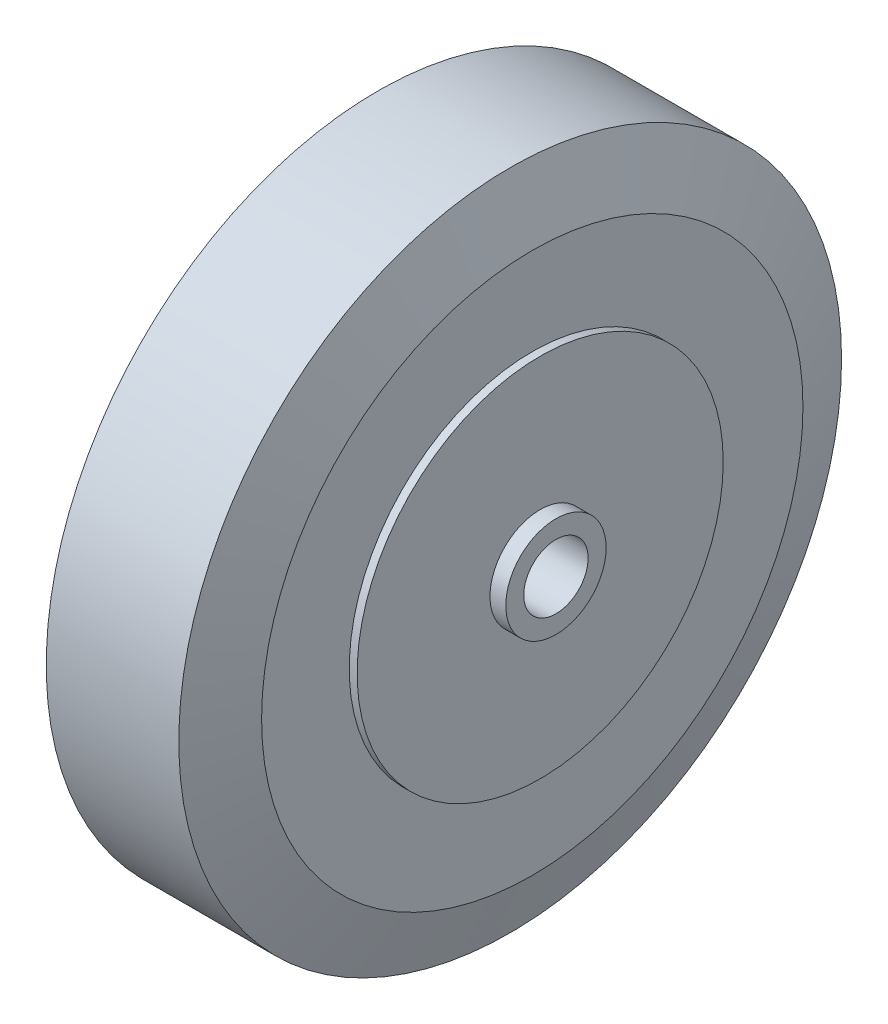
ISO-10303-21;
HEADER;
FILE_DESCRIPTION(('STEP AP214'),'2;1');
FILE_NAME('part.step','',(''),(''),'','','');
FILE_SCHEMA(('AUTOMOTIVE_DESIGN { 1 0 10303 214 1 1 1 1 }'));
ENDSEC;
DATA;
#1=APPLICATION_CONTEXT('core data for automotive mechanical design processes');
#2=APPLICATION_PROTOCOL_DEFINITION('international standard','automotive_design',2000,#1);
#3=PRODUCT_CONTEXT('',#1,'mechanical');
#4=PRODUCT('Part','Part','',(#3));
#5=PRODUCT_RELATED_PRODUCT_CATEGORY('part','',(#4));
#6=PRODUCT_DEFINITION_FORMATION('','',#4);
#7=PRODUCT_DEFINITION_CONTEXT('part definition',#1,'design');
#8=PRODUCT_DEFINITION('design','',#6,#7);
#9=PRODUCT_DEFINITION_SHAPE('','',#8);
#10=(LENGTH_UNIT() NAMED_UNIT(*) SI_UNIT(.MILLI.,.METRE.));
#11=(NAMED_UNIT(*) PLANE_ANGLE_UNIT() SI_UNIT($,.RADIAN.));
#12=(NAMED_UNIT(*) SI_UNIT($,.STERADIAN.) SOLID_ANGLE_UNIT());
#13=UNCERTAINTY_MEASURE_WITH_UNIT(LENGTH_MEASURE(1.E-05),#10,'distance_accuracy_value','');
#14=(GEOMETRIC_REPRESENTATION_CONTEXT(3) GLOBAL_UNCERTAINTY_ASSIGNED_CONTEXT((#13)) GLOBAL_UNIT_ASSIGNED_CONTEXT((#10,
#11,#12)) REPRESENTATION_CONTEXT('',''));
#15=CARTESIAN_POINT('',(0.,0.,0.));
#16=DIRECTION('',(0.,0.,1.));
#17=DIRECTION('',(1.,0.,0.));
#18=AXIS2_PLACEMENT_3D('',#15,#16,#17);
#19=CARTESIAN_POINT('',(0.,0.,0.));
#20=DIRECTION('',(1.,0.,0.));
#21=DIRECTION('',(0.,0.,-1.));
#22=AXIS2_PLACEMENT_3D('',#19,#20,#21);
#23=CYLINDRICAL_SURFACE('',#22,10.2);
#24=CARTESIAN_POINT('',(-35.5,0.,0.));
#25=DIRECTION('',(1.,0.,0.));
#26=DIRECTION('',(0.,0.,-1.));
#27=AXIS2_PLACEMENT_3D('',#24,#25,#26);
#28=CIRCLE('',#27,10.2);
#29=CARTESIAN_POINT('',(-35.5,0.,-10.2));
#30=VERTEX_POINT('',#29);
#31=EDGE_CURVE('E10',#30,#30,#28,.T.);
#32=ORIENTED_EDGE('',*,*,#31,.F.);
#33=EDGE_LOOP('',(#32));
#34=FACE_BOUND('',#33,.T.);
#35=CARTESIAN_POINT('',(35.5,0.,0.));
#36=DIRECTION('',(1.,0.,0.));
#37=DIRECTION('',(0.,0.,-1.));
#38=AXIS2_PLACEMENT_3D('',#35,#36,#37);
#39=CIRCLE('',#38,10.2);
#40=CARTESIAN_POINT('',(35.5,0.,-10.2));
#41=VERTEX_POINT('',#40);
#42=EDGE_CURVE('E61',#41,#41,#39,.T.);
#43=ORIENTED_EDGE('',*,*,#42,.T.);
#44=EDGE_LOOP('',(#43));
#45=FACE_BOUND('',#44,.T.);
#46=ADVANCED_FACE('F33',(#34,#45),#23,.F.);
#47=CARTESIAN_POINT('',(-35.5,10.2,0.));
#48=DIRECTION('',(-1.,0.,0.));
#49=DIRECTION('',(0.,0.,1.));
#50=AXIS2_PLACEMENT_3D('',#47,#48,#49);
#51=PLANE('',#50);
#52=ORIENTED_EDGE('',*,*,#31,.T.);
#53=EDGE_LOOP('',(#52));
#54=FACE_BOUND('',#53,.T.);
#55=CARTESIAN_POINT('',(-35.5,0.,0.));
#56=DIRECTION('',(1.,0.,0.));
#57=DIRECTION('',(0.,0.,-1.));
#58=AXIS2_PLACEMENT_3D('',#55,#56,#57);
#59=CIRCLE('',#58,15.9);
#60=CARTESIAN_POINT('',(-35.5,0.,-15.9));
#61=VERTEX_POINT('',#60);
#62=EDGE_CURVE('E39',#61,#61,#59,.T.);
#63=ORIENTED_EDGE('',*,*,#62,.F.);
#64=EDGE_LOOP('',(#63));
#65=FACE_BOUND('',#64,.T.);
#66=ADVANCED_FACE('F102',(#54,#65),#51,.T.);
#67=CARTESIAN_POINT('',(0.,0.,0.));
#68=DIRECTION('',(1.,0.,0.));
#69=DIRECTION('',(0.,0.,-1.));
#70=AXIS2_PLACEMENT_3D('',#67,#68,#69);
#71=CYLINDRICAL_SURFACE('',#70,15.9);
#72=ORIENTED_EDGE('',*,*,#62,.T.);
#73=EDGE_LOOP('',(#72));
#74=FACE_BOUND('',#73,.T.);
#75=CARTESIAN_POINT('',(-30.5,0.,0.));
#76=DIRECTION('',(1.,0.,0.));
#77=DIRECTION('',(0.,0.,-1.));
#78=AXIS2_PLACEMENT_3D('',#75,#76,#77);
#79=CIRCLE('',#78,15.9);
#80=CARTESIAN_POINT('',(-30.5,0.,-15.9));
#81=VERTEX_POINT('',#80);
#82=EDGE_CURVE('E43',#81,#81,#79,.T.);
#83=ORIENTED_EDGE('',*,*,#82,.F.);
#84=EDGE_LOOP('',(#83));
#85=FACE_BOUND('',#84,.T.);
#86=ADVANCED_FACE('F107',(#74,#85),#71,.T.);
#87=CARTESIAN_POINT('',(-30.5,15.9,0.));
#88=DIRECTION('',(-1.,0.,0.));
#89=DIRECTION('',(0.,0.,1.));
#90=AXIS2_PLACEMENT_3D('',#87,#88,#89);
#91=PLANE('',#90);
#92=ORIENTED_EDGE('',*,*,#82,.T.);
#93=EDGE_LOOP('',(#92));
#94=FACE_BOUND('',#93,.T.);
#95=CARTESIAN_POINT('',(-30.5,0.,0.));
#96=DIRECTION('',(1.,0.,0.));
#97=DIRECTION('',(0.,0.,-1.));
#98=AXIS2_PLACEMENT_3D('',#95,#96,#97);
#99=CIRCLE('',#98,58.);
#100=CARTESIAN_POINT('',(-30.5,0.,-58.));
#101=VERTEX_POINT('',#100);
#102=EDGE_CURVE('E47',#101,#101,#99,.T.);
#103=ORIENTED_EDGE('',*,*,#102,.F.);
#104=EDGE_LOOP('',(#103));
#105=FACE_BOUND('',#104,.T.);
#106=ADVANCED_FACE('F217',(#94,#105),#91,.T.);
#107=CARTESIAN_POINT('',(0.,0.,0.));
#108=DIRECTION('',(1.,0.,0.));
#109=DIRECTION('',(0.,0.,-1.));
#110=AXIS2_PLACEMENT_3D('',#107,#108,#109);
#111=CYLINDRICAL_SURFACE('',#110,58.);
#112=ORIENTED_EDGE('',*,*,#102,.T.);
#113=EDGE_LOOP('',(#112));
#114=FACE_BOUND('',#113,.T.);
#115=CARTESIAN_POINT('',(-28.,0.,0.));
#116=DIRECTION('',(1.,0.,0.));
#117=DIRECTION('',(0.,0.,-1.));
#118=AXIS2_PLACEMENT_3D('',#115,#116,#117);
#119=CIRCLE('',#118,58.);
#120=CARTESIAN_POINT('',(-28.,0.,-58.));
#121=VERTEX_POINT('',#120);
#122=EDGE_CURVE('E52',#121,#121,#119,.T.);
#123=ORIENTED_EDGE('',*,*,#122,.F.);
#124=EDGE_LOOP('',(#123));
#125=FACE_BOUND('',#124,.T.);
#126=ADVANCED_FACE('F206',(#114,#125),#111,.T.);
#127=CARTESIAN_POINT('',(-28.,58.,0.));
#128=DIRECTION('',(-1.,0.,0.));
#129=DIRECTION('',(0.,0.,1.));
#130=AXIS2_PLACEMENT_3D('',#127,#128,#129);
#131=PLANE('',#130);
#132=ORIENTED_EDGE('',*,*,#122,.T.);
#133=EDGE_LOOP('',(#132));
#134=FACE_BOUND('',#133,.T.);
#135=CARTESIAN_POINT('',(-28.,0.,0.));
#136=DIRECTION('',(1.,0.,0.));
#137=DIRECTION('',(0.,0.,-1.));
#138=AXIS2_PLACEMENT_3D('',#135,#136,#137);
#139=CIRCLE('',#138,85.7676580638177);
#140=CARTESIAN_POINT('',(-28.,0.,-85.7676580638177));
#141=VERTEX_POINT('',#140);
#142=EDGE_CURVE('E55',#141,#141,#139,.T.);
#143=ORIENTED_EDGE('',*,*,#142,.F.);
#144=EDGE_LOOP('',(#143));
#145=FACE_BOUND('',#144,.T.);
#146=ADVANCED_FACE('F98',(#134,#145),#131,.T.);
#147=CARTESIAN_POINT('',(-21.,0.,0.));
#148=DIRECTION('',(1.,0.,0.));
#149=DIRECTION('',(0.,0.,-1.));
#150=AXIS2_PLACEMENT_3D('',#147,#148,#149);
#151=CONICAL_SURFACE('',#150,105.,1.22173047639603);
#152=ORIENTED_EDGE('',*,*,#142,.T.);
#153=EDGE_LOOP('',(#152));
#154=FACE_BOUND('',#153,.T.);
#155=CARTESIAN_POINT('',(-21.,0.,0.));
#156=DIRECTION('',(1.,0.,0.));
#157=DIRECTION('',(0.,0.,-1.));
#158=AXIS2_PLACEMENT_3D('',#155,#156,#157);
#159=CIRCLE('',#158,105.);
#160=CARTESIAN_POINT('',(-21.,0.,-105.));
#161=VERTEX_POINT('',#160);
#162=EDGE_CURVE('E58',#161,#161,#159,.T.);
#163=ORIENTED_EDGE('',*,*,#162,.F.);
#164=EDGE_LOOP('',(#163));
#165=FACE_BOUND('',#164,.T.);
#166=ADVANCED_FACE('F88',(#154,#165),#151,.T.);
#167=CARTESIAN_POINT('',(0.,0.,0.));
#168=DIRECTION('',(1.,0.,0.));
#169=DIRECTION('',(0.,0.,-1.));
#170=AXIS2_PLACEMENT_3D('',#167,#168,#169);
#171=CYLINDRICAL_SURFACE('',#170,105.);
#172=ORIENTED_EDGE('',*,*,#162,.T.);
#173=EDGE_LOOP('',(#172));
#174=FACE_BOUND('',#173,.T.);
#175=CARTESIAN_POINT('',(21.,0.,0.));
#176=DIRECTION('',(1.,0.,0.));
#177=DIRECTION('',(0.,0.,-1.));
#178=AXIS2_PLACEMENT_3D('',#175,#176,#177);
#179=CIRCLE('',#178,105.);
#180=CARTESIAN_POINT('',(21.,0.,-105.));
#181=VERTEX_POINT('',#180);
#182=EDGE_CURVE('E79',#181,#181,#179,.T.);
#183=ORIENTED_EDGE('',*,*,#182,.F.);
#184=EDGE_LOOP('',(#183));
#185=FACE_BOUND('',#184,.T.);
#186=ADVANCED_FACE('F85',(#174,#185),#171,.T.);
#187=CARTESIAN_POINT('',(35.5,10.2,0.));
#188=DIRECTION('',(1.,0.,0.));
#189=DIRECTION('',(0.,0.,1.));
#190=AXIS2_PLACEMENT_3D('',#187,#188,#189);
#191=PLANE('',#190);
#192=ORIENTED_EDGE('',*,*,#42,.F.);
#193=EDGE_LOOP('',(#192));
#194=FACE_BOUND('',#193,.T.);
#195=CARTESIAN_POINT('',(35.5,0.,0.));
#196=DIRECTION('',(1.,0.,0.));
#197=DIRECTION('',(0.,0.,-1.));
#198=AXIS2_PLACEMENT_3D('',#195,#196,#197);
#199=CIRCLE('',#198,15.9);
#200=CARTESIAN_POINT('',(35.5,0.,-15.9));
#201=VERTEX_POINT('',#200);
#202=EDGE_CURVE('E64',#201,#201,#199,.T.);
#203=ORIENTED_EDGE('',*,*,#202,.T.);
#204=EDGE_LOOP('',(#203));
#205=FACE_BOUND('',#204,.T.);
#206=ADVANCED_FACE('F87',(#194,#205),#191,.T.);
#207=CARTESIAN_POINT('',(0.,0.,0.));
#208=DIRECTION('',(-1.,0.,0.));
#209=DIRECTION('',(0.,0.,-1.));
#210=AXIS2_PLACEMENT_3D('',#207,#208,#209);
#211=CYLINDRICAL_SURFACE('',#210,15.9);
#212=ORIENTED_EDGE('',*,*,#202,.F.);
#213=EDGE_LOOP('',(#212));
#214=FACE_BOUND('',#213,.T.);
#215=CARTESIAN_POINT('',(30.5,0.,0.));
#216=DIRECTION('',(1.,0.,0.));
#217=DIRECTION('',(0.,0.,-1.));
#218=AXIS2_PLACEMENT_3D('',#215,#216,#217);
#219=CIRCLE('',#218,15.9);
#220=CARTESIAN_POINT('',(30.5,0.,-15.9));
#221=VERTEX_POINT('',#220);
#222=EDGE_CURVE('E67',#221,#221,#219,.T.);
#223=ORIENTED_EDGE('',*,*,#222,.T.);
#224=EDGE_LOOP('',(#223));
#225=FACE_BOUND('',#224,.T.);
#226=ADVANCED_FACE('F95',(#214,#225),#211,.T.);
#227=CARTESIAN_POINT('',(30.5,15.9,0.));
#228=DIRECTION('',(1.,0.,0.));
#229=DIRECTION('',(0.,0.,1.));
#230=AXIS2_PLACEMENT_3D('',#227,#228,#229);
#231=PLANE('',#230);
#232=ORIENTED_EDGE('',*,*,#222,.F.);
#233=EDGE_LOOP('',(#232));
#234=FACE_BOUND('',#233,.T.);
#235=CARTESIAN_POINT('',(30.5,0.,0.));
#236=DIRECTION('',(1.,0.,0.));
#237=DIRECTION('',(0.,0.,-1.));
#238=AXIS2_PLACEMENT_3D('',#235,#236,#237);
#239=CIRCLE('',#238,58.);
#240=CARTESIAN_POINT('',(30.5,0.,-58.));
#241=VERTEX_POINT('',#240);
#242=EDGE_CURVE('E70',#241,#241,#239,.T.);
#243=ORIENTED_EDGE('',*,*,#242,.T.);
#244=EDGE_LOOP('',(#243));
#245=FACE_BOUND('',#244,.T.);
#246=ADVANCED_FACE('F115',(#234,#245),#231,.T.);
#247=CARTESIAN_POINT('',(0.,0.,0.));
#248=DIRECTION('',(-1.,0.,0.));
#249=DIRECTION('',(0.,0.,-1.));
#250=AXIS2_PLACEMENT_3D('',#247,#248,#249);
#251=CYLINDRICAL_SURFACE('',#250,58.);
#252=ORIENTED_EDGE('',*,*,#242,.F.);
#253=EDGE_LOOP('',(#252));
#254=FACE_BOUND('',#253,.T.);
#255=CARTESIAN_POINT('',(28.,0.,0.));
#256=DIRECTION('',(1.,0.,0.));
#257=DIRECTION('',(0.,0.,-1.));
#258=AXIS2_PLACEMENT_3D('',#255,#256,#257);
#259=CIRCLE('',#258,58.);
#260=CARTESIAN_POINT('',(28.,0.,-58.));
#261=VERTEX_POINT('',#260);
#262=EDGE_CURVE('E73',#261,#261,#259,.T.);
#263=ORIENTED_EDGE('',*,*,#262,.T.);
#264=EDGE_LOOP('',(#263));
#265=FACE_BOUND('',#264,.T.);
#266=ADVANCED_FACE('F121',(#254,#265),#251,.T.);
#267=CARTESIAN_POINT('',(28.,58.,0.));
#268=DIRECTION('',(1.,0.,0.));
#269=DIRECTION('',(0.,0.,1.));
#270=AXIS2_PLACEMENT_3D('',#267,#268,#269);
#271=PLANE('',#270);
#272=ORIENTED_EDGE('',*,*,#262,.F.);
#273=EDGE_LOOP('',(#272));
#274=FACE_BOUND('',#273,.T.);
#275=CARTESIAN_POINT('',(28.,0.,0.));
#276=DIRECTION('',(1.,0.,0.));
#277=DIRECTION('',(0.,0.,-1.));
#278=AXIS2_PLACEMENT_3D('',#275,#276,#277);
#279=CIRCLE('',#278,85.7676580638177);
#280=CARTESIAN_POINT('',(28.,0.,-85.7676580638177));
#281=VERTEX_POINT('',#280);
#282=EDGE_CURVE('E76',#281,#281,#279,.T.);
#283=ORIENTED_EDGE('',*,*,#282,.T.);
#284=EDGE_LOOP('',(#283));
#285=FACE_BOUND('',#284,.T.);
#286=ADVANCED_FACE('F127',(#274,#285),#271,.T.);
#287=CARTESIAN_POINT('',(21.,0.,0.));
#288=DIRECTION('',(-1.,0.,0.));
#289=DIRECTION('',(0.,0.,-1.));
#290=AXIS2_PLACEMENT_3D('',#287,#288,#289);
#291=CONICAL_SURFACE('',#290,105.,1.22173047639603);
#292=ORIENTED_EDGE('',*,*,#282,.F.);
#293=EDGE_LOOP('',(#292));
#294=FACE_BOUND('',#293,.T.);
#295=ORIENTED_EDGE('',*,*,#182,.T.);
#296=EDGE_LOOP('',(#295));
#297=FACE_BOUND('',#296,.T.);
#298=ADVANCED_FACE('F83',(#294,#297),#291,.T.);
#299=CLOSED_SHELL('',(#46,#66,#86,#106,#126,#146,#166,#186,#206,#226,#246,#266,#286,#298));
#300=MANIFOLD_SOLID_BREP('B2',#299);
#301=ADVANCED_BREP_SHAPE_REPRESENTATION('',(#18,#300),#14);
#302=SHAPE_DEFINITION_REPRESENTATION(#9,#301);
ENDSEC;
END-ISO-10303-21;
